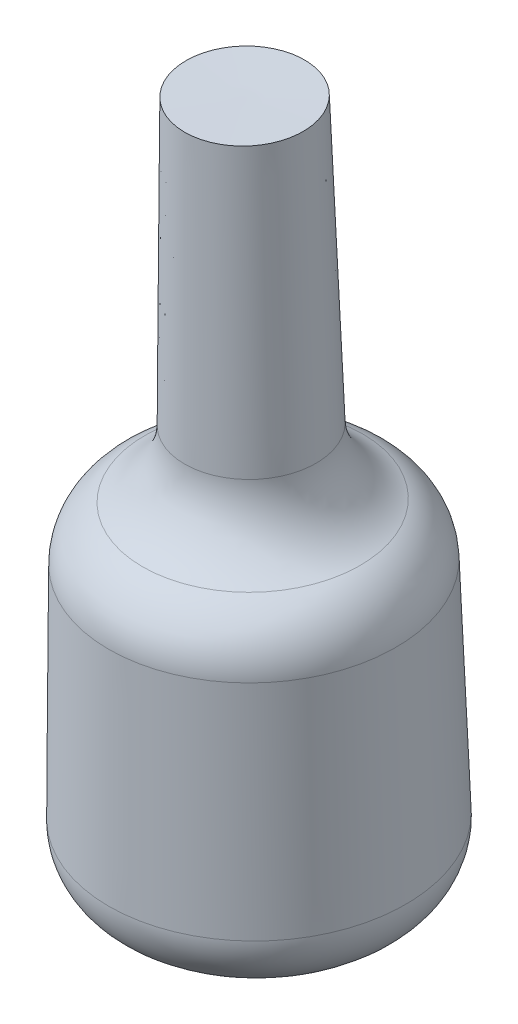
ISO-10303-21;
HEADER;
FILE_DESCRIPTION(('STEP AP214'),'2;1');
FILE_NAME('part.step','',(''),(''),'','','');
FILE_SCHEMA(('AUTOMOTIVE_DESIGN { 1 0 10303 214 1 1 1 1 }'));
ENDSEC;
DATA;
#1=APPLICATION_CONTEXT('core data for automotive mechanical design processes');
#2=APPLICATION_PROTOCOL_DEFINITION('international standard','automotive_design',2000,#1);
#3=PRODUCT_CONTEXT('',#1,'mechanical');
#4=PRODUCT('Part','Part','',(#3));
#5=PRODUCT_RELATED_PRODUCT_CATEGORY('part','',(#4));
#6=PRODUCT_DEFINITION_FORMATION('','',#4);
#7=PRODUCT_DEFINITION_CONTEXT('part definition',#1,'design');
#8=PRODUCT_DEFINITION('design','',#6,#7);
#9=PRODUCT_DEFINITION_SHAPE('','',#8);
#10=(LENGTH_UNIT() NAMED_UNIT(*) SI_UNIT(.MILLI.,.METRE.));
#11=(NAMED_UNIT(*) PLANE_ANGLE_UNIT() SI_UNIT($,.RADIAN.));
#12=(NAMED_UNIT(*) SI_UNIT($,.STERADIAN.) SOLID_ANGLE_UNIT());
#13=UNCERTAINTY_MEASURE_WITH_UNIT(LENGTH_MEASURE(1.E-05),#10,'distance_accuracy_value','');
#14=(GEOMETRIC_REPRESENTATION_CONTEXT(3) GLOBAL_UNCERTAINTY_ASSIGNED_CONTEXT((#13)) GLOBAL_UNIT_ASSIGNED_CONTEXT((#10,
#11,#12)) REPRESENTATION_CONTEXT('',''));
#15=CARTESIAN_POINT('',(0.,0.,0.));
#16=DIRECTION('',(0.,0.,1.));
#17=DIRECTION('',(1.,0.,0.));
#18=AXIS2_PLACEMENT_3D('',#15,#16,#17);
#19=CARTESIAN_POINT('',(0.,55.3136148981798,18.3946916054837));
#20=DIRECTION('',(0.,0.999740658515525,0.0227731357292829));
#21=DIRECTION('',(0.,-0.0227731357292829,0.999740658515525));
#22=AXIS2_PLACEMENT_3D('',#19,#20,#21);
#23=CONICAL_SURFACE('',#22,0.,1.54802122218843);
#24=CARTESIAN_POINT('',(0.,55.5375818811514,18.3997933590821));
#25=DIRECTION('',(0.,0.999740658515525,0.0227731357292829));
#26=DIRECTION('',(0.,-0.0227731357292829,0.999740658515525));
#27=AXIS2_PLACEMENT_3D('',#24,#25,#26);
#28=CIRCLE('',#27,9.83470109843719);
#29=CARTESIAN_POINT('',(0.,55.3136148981798,28.2319439115371));
#30=VERTEX_POINT('',#29);
#31=EDGE_CURVE('E89',#30,#30,#28,.T.);
#32=ORIENTED_EDGE('',*,*,#31,.T.);
#33=EDGE_LOOP('',(#32));
#34=FACE_BOUND('',#33,.T.);
#35=CARTESIAN_POINT('',(0.,55.3136148981798,18.3946916054837));
#36=VERTEX_POINT('',#35);
#37=VERTEX_LOOP('',#36);
#38=FACE_BOUND('',#37,.T.);
#39=ADVANCED_FACE('F39',(#34,#38),#23,.F.);
#40=CARTESIAN_POINT('',(0.,55.5375818811514,18.3997933590821));
#41=DIRECTION('',(0.,-0.999740658515525,-0.0227731357292829));
#42=DIRECTION('',(0.,0.0227731357292829,-0.999740658515525));
#43=AXIS2_PLACEMENT_3D('',#40,#41,#42);
#44=CONICAL_SURFACE('',#43,9.83470109843719,0.022775104606471);
#45=CARTESIAN_POINT('',(0.,8.41723606902953,17.3264369624507));
#46=DIRECTION('',(0.,0.999740658515525,0.0227731357292829));
#47=DIRECTION('',(0.,-0.0227731357292829,0.999740658515525));
#48=AXIS2_PLACEMENT_3D('',#45,#46,#47);
#49=CIRCLE('',#48,10.9083359331205);
#50=CARTESIAN_POINT('',(0.,8.16881905424396,28.2319439115371));
#51=VERTEX_POINT('',#50);
#52=EDGE_CURVE('E88',#51,#51,#49,.T.);
#53=ORIENTED_EDGE('',*,*,#52,.T.);
#54=EDGE_LOOP('',(#53));
#55=FACE_BOUND('',#54,.T.);
#56=ORIENTED_EDGE('',*,*,#31,.F.);
#57=EDGE_LOOP('',(#56));
#58=FACE_BOUND('',#57,.T.);
#59=ADVANCED_FACE('F69',(#55,#58),#44,.T.);
#60=CARTESIAN_POINT('',(0.,8.70054331921586,17.3328904305642));
#61=DIRECTION('',(0.,0.999740658515525,0.0227731357292829));
#62=DIRECTION('',(0.,-0.0227731357292829,0.999740658515525));
#63=AXIS2_PLACEMENT_3D('',#60,#61,#62);
#64=TOROIDAL_SURFACE('',#63,23.3487505318894,12.443641751293);
#65=CARTESIAN_POINT('',(0.,-2.56010284665948,17.0763836841889));
#66=DIRECTION('',(0.,0.999740658515525,0.0227731357292829));
#67=DIRECTION('',(0.,-0.0227731357292829,0.999740658515525));
#68=AXIS2_PLACEMENT_3D('',#65,#66,#67);
#69=CIRCLE('',#68,18.0594904465331);
#70=CARTESIAN_POINT('',(0.,-2.97137407380007,35.1311905556608));
#71=VERTEX_POINT('',#70);
#72=EDGE_CURVE('E47',#71,#71,#69,.T.);
#73=ORIENTED_EDGE('',*,*,#72,.T.);
#74=EDGE_LOOP('',(#73));
#75=FACE_BOUND('',#74,.T.);
#76=ORIENTED_EDGE('',*,*,#52,.F.);
#77=EDGE_LOOP('',(#76));
#78=FACE_BOUND('',#77,.T.);
#79=ADVANCED_FACE('F64',(#75,#78),#64,.F.);
#80=CARTESIAN_POINT('',(0.,-3.73664496396357,17.0495831803779));
#81=DIRECTION('',(0.,-0.999740658515525,-0.0227731357292829));
#82=DIRECTION('',(0.,0.0227731357292829,-0.999740658515525));
#83=AXIS2_PLACEMENT_3D('',#80,#81,#82);
#84=CONICAL_SURFACE('',#83,23.6321312744582,0.0227751046064711);
#85=CARTESIAN_POINT('',(0.,-11.381747775925,16.8754350525428));
#86=DIRECTION('',(0.,0.999740658515525,0.0227731357292829));
#87=DIRECTION('',(0.,-0.0227731357292829,0.999740658515525));
#88=AXIS2_PLACEMENT_3D('',#85,#86,#87);
#89=CIRCLE('',#88,23.8063245778432);
#90=CARTESIAN_POINT('',(0.,-11.9238924367516,40.6755856628301));
#91=VERTEX_POINT('',#90);
#92=EDGE_CURVE('E11',#91,#91,#89,.F.);
#93=ORIENTED_EDGE('',*,*,#92,.T.);
#94=EDGE_LOOP('',(#93));
#95=FACE_BOUND('',#94,.T.);
#96=CARTESIAN_POINT('',(0.,-47.861503407673,16.0444611201568));
#97=DIRECTION('',(0.,0.999740658515525,0.0227731357292829));
#98=DIRECTION('',(0.,-0.0227731357292829,0.999740658515525));
#99=AXIS2_PLACEMENT_3D('',#96,#97,#98);
#100=CIRCLE('',#99,24.6375140721466);
#101=CARTESIAN_POINT('',(0.,-48.4225768596701,40.6755856628301));
#102=VERTEX_POINT('',#101);
#103=EDGE_CURVE('E91',#102,#102,#100,.T.);
#104=ORIENTED_EDGE('',*,*,#103,.T.);
#105=EDGE_LOOP('',(#104));
#106=FACE_BOUND('',#105,.T.);
#107=ADVANCED_FACE('F56',(#95,#106),#84,.T.);
#108=CARTESIAN_POINT('',(0.,-57.8563172505634,15.8167888230522));
#109=DIRECTION('',(0.,0.999740658515525,0.0227731357292829));
#110=DIRECTION('',(0.,-0.0227731357292829,0.999740658515525));
#111=AXIS2_PLACEMENT_3D('',#108,#109,#110);
#112=CONICAL_SURFACE('',#111,24.8652454294394,1.54802122218843);
#113=CARTESIAN_POINT('',(0.,-58.083989547668,15.8116026659427));
#114=DIRECTION('',(0.,-0.999740658515525,-0.0227731357292829));
#115=DIRECTION('',(0.,0.0227731357292829,-0.999740658515525));
#116=AXIS2_PLACEMENT_3D('',#113,#114,#115);
#117=CIRCLE('',#116,14.8678388442841);
#118=CARTESIAN_POINT('',(0.,-57.745402235666,0.947619669055414));
#119=VERTEX_POINT('',#118);
#120=EDGE_CURVE('E96',#119,#119,#117,.T.);
#121=ORIENTED_EDGE('',*,*,#120,.T.);
#122=EDGE_LOOP('',(#121));
#123=FACE_BOUND('',#122,.T.);
#124=CARTESIAN_POINT('',(0.,-58.42257685967,15.8038899709085));
#125=VERTEX_POINT('',#124);
#126=VERTEX_LOOP('',#125);
#127=FACE_BOUND('',#126,.T.);
#128=ADVANCED_FACE('F53',(#123,#127),#112,.T.);
#129=CARTESIAN_POINT('',(0.,-48.0891757047774,16.0392749630473));
#130=DIRECTION('',(0.,-0.999740658515525,-0.0227731357292829));
#131=DIRECTION('',(0.,0.0227731357292829,-0.999740658515525));
#132=AXIS2_PLACEMENT_3D('',#129,#130,#131);
#133=TOROIDAL_SURFACE('',#132,14.6401074869913,10.);
#134=ORIENTED_EDGE('',*,*,#120,.F.);
#135=EDGE_LOOP('',(#134));
#136=FACE_BOUND('',#135,.T.);
#137=ORIENTED_EDGE('',*,*,#103,.F.);
#138=EDGE_LOOP('',(#137));
#139=FACE_BOUND('',#138,.T.);
#140=ADVANCED_FACE('F55',(#136,#139),#133,.T.);
#141=CARTESIAN_POINT('',(0.,-11.6094200730295,16.8702488954334));
#142=DIRECTION('',(0.,-0.999740658515525,-0.0227731357292829));
#143=DIRECTION('',(0.,0.0227731357292829,-0.999740658515525));
#144=AXIS2_PLACEMENT_3D('',#141,#142,#143);
#145=TOROIDAL_SURFACE('',#144,13.8089179926879,10.);
#146=ORIENTED_EDGE('',*,*,#92,.F.);
#147=EDGE_LOOP('',(#146));
#148=FACE_BOUND('',#147,.T.);
#149=ORIENTED_EDGE('',*,*,#72,.F.);
#150=EDGE_LOOP('',(#149));
#151=FACE_BOUND('',#150,.T.);
#152=ADVANCED_FACE('F41',(#148,#151),#145,.T.);
#153=CLOSED_SHELL('',(#39,#59,#79,#107,#128,#140,#152));
#154=MANIFOLD_SOLID_BREP('B2',#153);
#155=ADVANCED_BREP_SHAPE_REPRESENTATION('',(#18,#154),#14);
#156=SHAPE_DEFINITION_REPRESENTATION(#9,#155);
ENDSEC;
END-ISO-10303-21;
